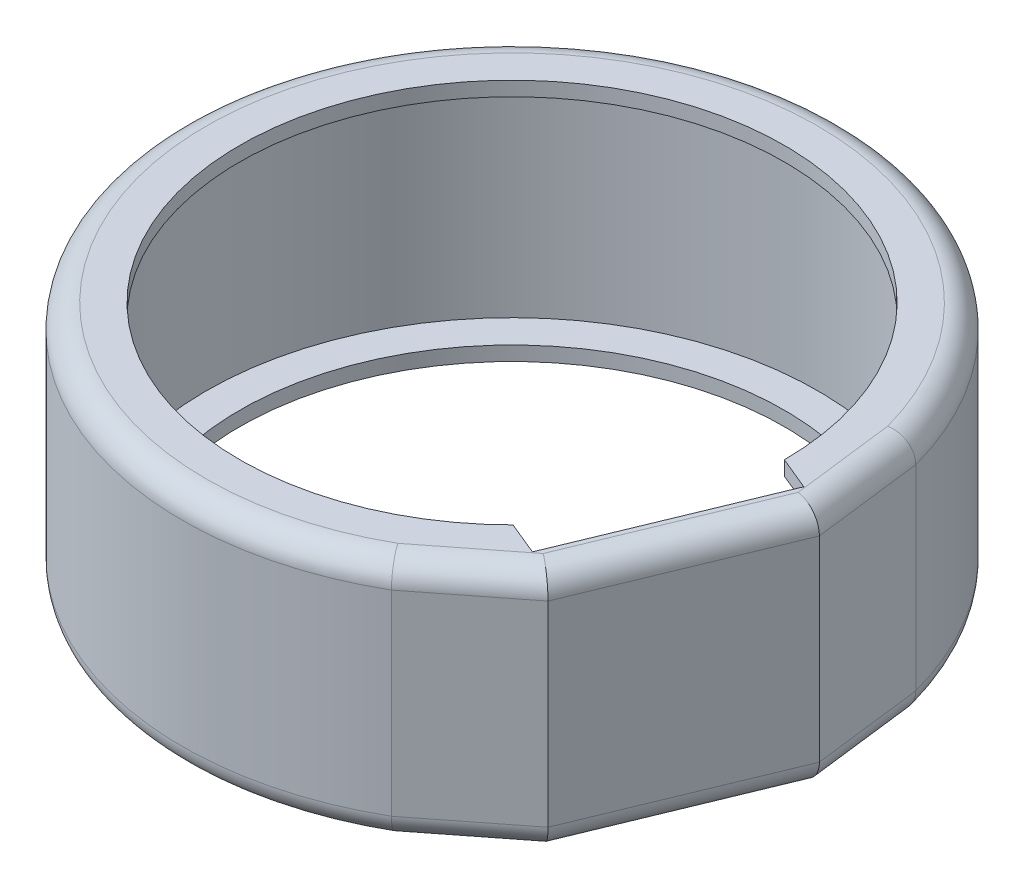
ISO-10303-21;
HEADER;
FILE_DESCRIPTION(('STEP AP214'),'2;1');
FILE_NAME('part.step','',(''),(''),'','','');
FILE_SCHEMA(('AUTOMOTIVE_DESIGN { 1 0 10303 214 1 1 1 1 }'));
ENDSEC;
DATA;
#1=APPLICATION_CONTEXT('core data for automotive mechanical design processes');
#2=APPLICATION_PROTOCOL_DEFINITION('international standard','automotive_design',2000,#1);
#3=PRODUCT_CONTEXT('',#1,'mechanical');
#4=PRODUCT('Part','Part','',(#3));
#5=PRODUCT_RELATED_PRODUCT_CATEGORY('part','',(#4));
#6=PRODUCT_DEFINITION_FORMATION('','',#4);
#7=PRODUCT_DEFINITION_CONTEXT('part definition',#1,'design');
#8=PRODUCT_DEFINITION('design','',#6,#7);
#9=PRODUCT_DEFINITION_SHAPE('','',#8);
#10=(LENGTH_UNIT() NAMED_UNIT(*) SI_UNIT(.MILLI.,.METRE.));
#11=(NAMED_UNIT(*) PLANE_ANGLE_UNIT() SI_UNIT($,.RADIAN.));
#12=(NAMED_UNIT(*) SI_UNIT($,.STERADIAN.) SOLID_ANGLE_UNIT());
#13=UNCERTAINTY_MEASURE_WITH_UNIT(LENGTH_MEASURE(1.E-05),#10,'distance_accuracy_value','');
#14=(GEOMETRIC_REPRESENTATION_CONTEXT(3) GLOBAL_UNCERTAINTY_ASSIGNED_CONTEXT((#13)) GLOBAL_UNIT_ASSIGNED_CONTEXT((#10,
#11,#12)) REPRESENTATION_CONTEXT('',''));
#15=CARTESIAN_POINT('',(0.,0.,0.));
#16=DIRECTION('',(0.,0.,1.));
#17=DIRECTION('',(1.,0.,0.));
#18=AXIS2_PLACEMENT_3D('',#15,#16,#17);
#19=CARTESIAN_POINT('',(12.5713590861021,-0.4,-1.54597575397623));
#20=DIRECTION('',(-0.122056550207776,0.,-0.992523147614894));
#21=DIRECTION('',(-0.992523147614894,0.,0.122056550207776));
#22=AXIS2_PLACEMENT_3D('',#19,#20,#21);
#23=CYLINDRICAL_SURFACE('',#22,1.);
#24=CARTESIAN_POINT('',(12.8711156040075,-0.4,0.891544249358785));
#25=DIRECTION('',(-0.134165315329187,0.,0.990958963914561));
#26=DIRECTION('',(-0.990958963914561,0.,-0.134165315329187));
#27=AXIS2_PLACEMENT_3D('',#24,#25,#26);
#28=ELLIPSE('',#27,1.03394016699174,1.);
#29=CARTESIAN_POINT('',(13.8957078806392,-0.4,1.03026315789474));
#30=VERTEX_POINT('',#29);
#31=CARTESIAN_POINT('',(12.8711156040075,0.6,0.89154424935878));
#32=VERTEX_POINT('',#31);
#33=EDGE_CURVE('E11',#30,#32,#28,.T.);
#34=ORIENTED_EDGE('',*,*,#33,.F.);
#35=DIRECTION('',(0.122056550207776,0.,0.992523147614894));
#36=VECTOR('',#35,1.);
#37=CARTESIAN_POINT('',(13.563882233717,-0.4,-1.66803230418401));
#38=LINE('',#37,#36);
#39=CARTESIAN_POINT('',(13.3297764027891,-0.4,-3.5717028224148));
#40=VERTEX_POINT('',#39);
#41=EDGE_CURVE('E312',#40,#30,#38,.T.);
#42=ORIENTED_EDGE('',*,*,#41,.F.);
#43=CARTESIAN_POINT('',(13.3297764027891,-0.4,-3.57170282241479));
#44=CARTESIAN_POINT('',(13.3297762561318,-0.371916414340494,-3.5717027762906));
#45=CARTESIAN_POINT('',(13.3286115661026,-0.343846300329724,-3.57147628903287));
#46=CARTESIAN_POINT('',(13.3239653960358,-0.28790729104696,-3.57057267398163));
#47=CARTESIAN_POINT('',(13.3204840377022,-0.260038385282429,-3.56989556986085));
#48=CARTESIAN_POINT('',(13.3065984979732,-0.17708171106861,-3.56719463058089));
#49=CARTESIAN_POINT('',(13.292752758156,-0.122550249127764,-3.56450115121073));
#50=CARTESIAN_POINT('',(13.2562741146347,-0.0166322025543488,-3.55740144462552));
#51=CARTESIAN_POINT('',(13.2336372231607,0.0347529426085676,-3.55299444013422));
#52=CARTESIAN_POINT('',(13.1802302598131,0.132923749634682,-3.5425903151592));
#53=CARTESIAN_POINT('',(13.1494619629337,0.179710412240616,-3.53659354170321));
#54=CARTESIAN_POINT('',(13.0806368889508,0.267413619696104,-3.52316864298163));
#55=CARTESIAN_POINT('',(13.0425728535977,0.308324247197636,-3.51573909225542));
#56=CARTESIAN_POINT('',(12.9602460052407,0.383086496852746,-3.49965481280123));
#57=CARTESIAN_POINT('',(12.9159810749181,0.416935697987592,-3.49099966557779));
#58=CARTESIAN_POINT('',(12.8224065407459,0.476687509612998,-3.47268340905768));
#59=CARTESIAN_POINT('',(12.7730841797457,0.502569330968472,-3.46301975469814));
#60=CARTESIAN_POINT('',(12.6709059321237,0.545528484618581,-3.44297669979578));
#61=CARTESIAN_POINT('',(12.6180531478254,0.562613435020208,-3.43259792740931));
#62=CARTESIAN_POINT('',(12.5310653185663,0.582741908676377,-3.41549501655581));
#63=CARTESIAN_POINT('',(12.4975393399765,0.588658196474452,-3.40889854595797));
#64=CARTESIAN_POINT('',(12.4301018378076,0.596928945404694,-3.39561958375672));
#65=CARTESIAN_POINT('',(12.3961909812984,0.599288832881079,-3.38893723892541));
#66=CARTESIAN_POINT('',(12.356827980813,0.599954135942361,-3.38117451273628));
#67=CARTESIAN_POINT('',(12.3513825411945,0.60000012180395,-3.38010049138206));
#68=CARTESIAN_POINT('',(12.345937797267,0.6,-3.37902647311527));
#69=B_SPLINE_CURVE_WITH_KNOTS('',3,(#43,#44,#45,#46,#47,#48,#49,#50,#51,#52,#53,#54,#55,#56,#57,
#58,#59,#60,#61,#62,#63,#64,#65,#66,#67,#68),.UNSPECIFIED.,.F.,.F.,(4,2,2,2,2,2,2,2,2,2,2,2,4),
(0.,0.084198950647967,0.168393478335985,0.336504907099607,0.504692682425953,0.672843774539834,
0.841163030253606,1.00953989993223,1.17835245939978,1.34701857994127,1.45089210384701,
1.55460697682603,1.57125769446634),.UNSPECIFIED.);
#70=CARTESIAN_POINT('',(12.345937797267,0.6,-3.37902647311528));
#71=VERTEX_POINT('',#70);
#72=EDGE_CURVE('E44',#40,#71,#69,.T.);
#73=ORIENTED_EDGE('',*,*,#72,.T.);
#74=DIRECTION('',(0.122056550207776,0.,0.992523147614894));
#75=VECTOR('',#74,1.);
#76=CARTESIAN_POINT('',(12.5713590861021,0.6,-1.54597575397623));
#77=LINE('',#76,#75);
#78=EDGE_CURVE('E294',#32,#71,#77,.F.);
#79=ORIENTED_EDGE('',*,*,#78,.F.);
#80=EDGE_LOOP('',(#34,#42,#73,#79));
#81=FACE_BOUND('',#80,.T.);
#82=ADVANCED_FACE('F36',(#81),#23,.T.);
#83=CARTESIAN_POINT('',(0.,-0.4,0.));
#84=DIRECTION('',(0.,1.,0.));
#85=DIRECTION('',(0.,0.,1.));
#86=AXIS2_PLACEMENT_3D('',#83,#84,#85);
#87=TOROIDAL_SURFACE('',#86,12.8,1.);
#88=ORIENTED_EDGE('',*,*,#72,.F.);
#89=CARTESIAN_POINT('',(0.,-0.4,0.));
#90=DIRECTION('',(0.,1.,0.));
#91=DIRECTION('',(0.,0.,1.));
#92=AXIS2_PLACEMENT_3D('',#89,#90,#91);
#93=CIRCLE('',#92,13.8);
#94=CARTESIAN_POINT('',(6.89999999999997,-0.4,11.9511505722253));
#95=VERTEX_POINT('',#94);
#96=EDGE_CURVE('E309',#95,#40,#93,.F.);
#97=ORIENTED_EDGE('',*,*,#96,.F.);
#98=CARTESIAN_POINT('',(6.89999999999995,-0.4,11.9511505722253));
#99=CARTESIAN_POINT('',(6.89999992935616,-0.371917426694174,11.9511504364481));
#100=CARTESIAN_POINT('',(6.89933584598267,-0.343848324888395,11.9501672122749));
#101=CARTESIAN_POINT('',(6.89668677546159,-0.287911340258808,11.9462448664894));
#102=CARTESIAN_POINT('',(6.8947018578279,-0.260043446923662,11.9433058478083));
#103=CARTESIAN_POINT('',(6.88678514804693,-0.177089876224109,11.9315832712067));
#104=CARTESIAN_POINT('',(6.87889134486308,-0.1225604966033,11.9198941141875));
#105=CARTESIAN_POINT('',(6.8580964215101,-0.0166465405634291,11.8890950438101));
#106=CARTESIAN_POINT('',(6.84519303133753,0.0347365979561592,11.8699817663444));
#107=CARTESIAN_POINT('',(6.81475513901414,0.132903679247517,11.8248834081528));
#108=CARTESIAN_POINT('',(6.79722164549352,0.179688620656828,11.7988998240654));
#109=CARTESIAN_POINT('',(6.75800874984913,0.267389836823159,11.7407694943242));
#110=CARTESIAN_POINT('',(6.73632513169545,0.308300068963971,11.7086164811844));
#111=CARTESIAN_POINT('',(6.68943771294215,0.38306204346791,11.6390635752552));
#112=CARTESIAN_POINT('',(6.6642327106441,0.416911366370878,11.6016618912985));
#113=CARTESIAN_POINT('',(6.61096304523261,0.476665634143304,11.5225803566592));
#114=CARTESIAN_POINT('',(6.58289102565305,0.502549421682252,11.480889498287));
#115=CARTESIAN_POINT('',(6.52475251437733,0.545512825455888,11.3945041353445));
#116=CARTESIAN_POINT('',(6.49468777006021,0.562600042890162,11.3498122618634));
#117=CARTESIAN_POINT('',(6.44520810563581,0.582737564275861,11.2762224141644));
#118=CARTESIAN_POINT('',(6.42613366220432,0.588658192576283,11.2478448745982));
#119=CARTESIAN_POINT('',(6.38777261485133,0.596933047618758,11.1907560803979));
#120=CARTESIAN_POINT('',(6.36848637985926,0.599292712799944,11.1620454022678));
#121=CARTESIAN_POINT('',(6.34612119389626,0.599954593683484,11.1287405339508));
#122=CARTESIAN_POINT('',(6.34304234504274,0.600000120565802,11.1241554657972));
#123=CARTESIAN_POINT('',(6.33996398285252,0.6,11.1195708863307));
#124=B_SPLINE_CURVE_WITH_KNOTS('',3,(#98,#99,#100,#101,#102,#103,#104,#105,#106,#107,#108,#109,
#110,#111,#112,#113,#114,#115,#116,#117,#118,#119,#120,#121,#122,#123),.UNSPECIFIED.,.F.,.F.,(4,
2,2,2,2,2,2,2,2,2,2,2,4),(0.,0.084195914292554,0.168387397807622,0.336492516198596,
0.504673897447146,0.672818671935146,0.841135176846776,1.0095092619555,1.17832678208629,
1.34699817950188,1.45094341699295,1.55472974410938,1.57129805830179),.UNSPECIFIED.);
#125=CARTESIAN_POINT('',(6.3399639828525,0.6,11.1195708863307));
#126=VERTEX_POINT('',#125);
#127=EDGE_CURVE('E317',#95,#126,#124,.T.);
#128=ORIENTED_EDGE('',*,*,#127,.T.);
#129=CARTESIAN_POINT('',(0.,0.6,0.));
#130=DIRECTION('',(0.,1.,0.));
#131=DIRECTION('',(0.,0.,1.));
#132=AXIS2_PLACEMENT_3D('',#129,#130,#131);
#133=CIRCLE('',#132,12.8);
#134=EDGE_CURVE('E297',#71,#126,#133,.T.);
#135=ORIENTED_EDGE('',*,*,#134,.F.);
#136=EDGE_LOOP('',(#88,#97,#128,#135));
#137=FACE_BOUND('',#136,.T.);
#138=ADVANCED_FACE('F328',(#137),#87,.T.);
#139=CARTESIAN_POINT('',(7.80842818196018,-0.4,9.9694131981489));
#140=DIRECTION('',(-0.787264297794474,0.,0.616615703188115));
#141=DIRECTION('',(0.616615703188115,0.,0.787264297794474));
#142=AXIS2_PLACEMENT_3D('',#139,#140,#141);
#143=CYLINDRICAL_SURFACE('',#142,1.);
#144=ORIENTED_EDGE('',*,*,#127,.F.);
#145=DIRECTION('',(-0.787264297794474,0.,0.616615703188115));
#146=VECTOR('',#145,1.);
#147=CARTESIAN_POINT('',(8.42504388514829,-0.4,10.7566774959434));
#148=LINE('',#147,#146);
#149=CARTESIAN_POINT('',(10.575971038534,-0.4,9.0719885510656));
#150=VERTEX_POINT('',#149);
#151=EDGE_CURVE('E306',#150,#95,#148,.T.);
#152=ORIENTED_EDGE('',*,*,#151,.F.);
#153=CARTESIAN_POINT('',(9.75209281075188,-0.4,8.44706024095035));
#154=DIRECTION('',(-0.604335682377465,0.,0.796729805520895));
#155=DIRECTION('',(-0.796729805520895,0.,-0.604335682377466));
#156=AXIS2_PLACEMENT_3D('',#153,#154,#155);
#157=ELLIPSE('',#156,1.03407481692422,1.);
#158=CARTESIAN_POINT('',(9.75209281075188,0.6,8.44706024095034));
#159=VERTEX_POINT('',#158);
#160=EDGE_CURVE('E315',#150,#159,#157,.T.);
#161=ORIENTED_EDGE('',*,*,#160,.T.);
#162=DIRECTION('',(-0.787264297794474,0.,0.616615703188115));
#163=VECTOR('',#162,1.);
#164=CARTESIAN_POINT('',(7.80842818196018,0.6,9.9694131981489));
#165=LINE('',#164,#163);
#166=EDGE_CURVE('E300',#126,#159,#165,.F.);
#167=ORIENTED_EDGE('',*,*,#166,.F.);
#168=EDGE_LOOP('',(#144,#152,#161,#167));
#169=FACE_BOUND('',#168,.T.);
#170=ADVANCED_FACE('F330',(#169),#143,.T.);
#171=CARTESIAN_POINT('',(11.311503207498,-0.4,4.66954690711175));
#172=DIRECTION('',(-0.381578947368421,0.,0.924336252088604));
#173=DIRECTION('',(0.924336252088604,0.,0.381578947368421));
#174=AXIS2_PLACEMENT_3D('',#171,#172,#173);
#175=CYLINDRICAL_SURFACE('',#174,1.);
#176=DIRECTION('',(-0.381578947368421,0.,0.924336252088604));
#177=VECTOR('',#176,1.);
#178=CARTESIAN_POINT('',(12.2358394595866,-0.4,5.05112585448017));
#179=LINE('',#178,#177);
#180=EDGE_CURVE('E290',#30,#150,#179,.T.);
#181=ORIENTED_EDGE('',*,*,#180,.F.);
#182=ORIENTED_EDGE('',*,*,#33,.T.);
#183=DIRECTION('',(-0.381578947368421,0.,0.924336252088604));
#184=VECTOR('',#183,1.);
#185=CARTESIAN_POINT('',(11.311503207498,0.6,4.66954690711175));
#186=LINE('',#185,#184);
#187=EDGE_CURVE('E303',#159,#32,#186,.F.);
#188=ORIENTED_EDGE('',*,*,#187,.F.);
#189=ORIENTED_EDGE('',*,*,#160,.F.);
#190=EDGE_LOOP('',(#181,#182,#188,#189));
#191=FACE_BOUND('',#190,.T.);
#192=ADVANCED_FACE('F38',(#191),#175,.T.);
#193=CARTESIAN_POINT('',(12.5713590861021,-8.6,-1.54597575397623));
#194=DIRECTION('',(0.122056550207776,0.,0.992523147614894));
#195=DIRECTION('',(0.992523147614894,0.,-0.122056550207776));
#196=AXIS2_PLACEMENT_3D('',#193,#194,#195);
#197=CYLINDRICAL_SURFACE('',#196,1.);
#198=CARTESIAN_POINT('',(13.3297764027891,-8.6,-3.57170282241479));
#199=CARTESIAN_POINT('',(13.3297762561318,-8.62808358565951,-3.57170277629059));
#200=CARTESIAN_POINT('',(13.3286115661026,-8.65615369967028,-3.57147628903286));
#201=CARTESIAN_POINT('',(13.3239653960358,-8.71209270895304,-3.57057267398163));
#202=CARTESIAN_POINT('',(13.3204840377022,-8.73996161471757,-3.56989556986084));
#203=CARTESIAN_POINT('',(13.3065984979732,-8.82291828893139,-3.56719463058089));
#204=CARTESIAN_POINT('',(13.292752758156,-8.87744975087223,-3.56450115121072));
#205=CARTESIAN_POINT('',(13.2562741146347,-8.98336779744565,-3.55740144462552));
#206=CARTESIAN_POINT('',(13.2336372231606,-9.03475294260857,-3.55299444013423));
#207=CARTESIAN_POINT('',(13.1802302598131,-9.13292374963468,-3.54259031515922));
#208=CARTESIAN_POINT('',(13.1494619629337,-9.17971041224062,-3.53659354170323));
#209=CARTESIAN_POINT('',(13.0806368889508,-9.2674136196961,-3.52316864298163));
#210=CARTESIAN_POINT('',(13.0425728535977,-9.30832424719764,-3.51573909225541));
#211=CARTESIAN_POINT('',(12.9602460052407,-9.38308649685275,-3.49965481280123));
#212=CARTESIAN_POINT('',(12.9159810749181,-9.41693569798759,-3.4909996655778));
#213=CARTESIAN_POINT('',(12.8224065407459,-9.476687509613,-3.47268340905769));
#214=CARTESIAN_POINT('',(12.7730841797457,-9.50256933096847,-3.46301975469814));
#215=CARTESIAN_POINT('',(12.6709059321237,-9.54552848461858,-3.44297669979579));
#216=CARTESIAN_POINT('',(12.6180531478254,-9.56261343502021,-3.43259792740933));
#217=CARTESIAN_POINT('',(12.5310653185663,-9.58274190867638,-3.41549501655582));
#218=CARTESIAN_POINT('',(12.4975393399765,-9.58865819647445,-3.40889854595798));
#219=CARTESIAN_POINT('',(12.4301018378076,-9.5969289454047,-3.39561958375673));
#220=CARTESIAN_POINT('',(12.3961909812984,-9.59928883288108,-3.38893723892544));
#221=CARTESIAN_POINT('',(12.356827980813,-9.59995413594236,-3.38117451273629));
#222=CARTESIAN_POINT('',(12.3513825411945,-9.60000012180395,-3.38010049138207));
#223=CARTESIAN_POINT('',(12.345937797267,-9.6,-3.37902647311527));
#224=B_SPLINE_CURVE_WITH_KNOTS('',3,(#198,#199,#200,#201,#202,#203,#204,#205,#206,#207,#208,
#209,#210,#211,#212,#213,#214,#215,#216,#217,#218,#219,#220,#221,#222,#223),.UNSPECIFIED.,.F.,
.F.,(4,2,2,2,2,2,2,2,2,2,2,2,4),(0.,0.0841989506479641,0.168393478335984,0.336504907099607,
0.504692682425953,0.672843774539834,0.841163030253605,1.00953989993222,1.17835245939977,
1.34701857994127,1.450892103847,1.55460697682603,1.57125769446634),.UNSPECIFIED.);
#225=CARTESIAN_POINT('',(13.3297764027891,-8.6,-3.5717028224148));
#226=VERTEX_POINT('',#225);
#227=CARTESIAN_POINT('',(12.345937797267,-9.6,-3.37902647311528));
#228=VERTEX_POINT('',#227);
#229=EDGE_CURVE('E284',#226,#228,#224,.T.);
#230=ORIENTED_EDGE('',*,*,#229,.F.);
#231=DIRECTION('',(-0.122056550207776,0.,-0.992523147614894));
#232=VECTOR('',#231,1.);
#233=CARTESIAN_POINT('',(13.563882233717,-8.6,-1.66803230418401));
#234=LINE('',#233,#232);
#235=CARTESIAN_POINT('',(13.8957078806392,-8.6,1.03026315789474));
#236=VERTEX_POINT('',#235);
#237=EDGE_CURVE('E257',#236,#226,#234,.T.);
#238=ORIENTED_EDGE('',*,*,#237,.F.);
#239=CARTESIAN_POINT('',(12.8711156040075,-8.6,0.891544249358773));
#240=DIRECTION('',(-0.134165315329187,0.,0.990958963914561));
#241=DIRECTION('',(0.990958963914561,0.,0.134165315329187));
#242=AXIS2_PLACEMENT_3D('',#239,#240,#241);
#243=ELLIPSE('',#242,1.03394016699174,1.);
#244=CARTESIAN_POINT('',(12.8711156040075,-9.6,0.89154424935878));
#245=VERTEX_POINT('',#244);
#246=EDGE_CURVE('E291',#236,#245,#243,.F.);
#247=ORIENTED_EDGE('',*,*,#246,.T.);
#248=DIRECTION('',(-0.122056550207776,0.,-0.992523147614894));
#249=VECTOR('',#248,1.);
#250=CARTESIAN_POINT('',(12.5713590861021,-9.6,-1.54597575397623));
#251=LINE('',#250,#249);
#252=EDGE_CURVE('E239',#228,#245,#251,.F.);
#253=ORIENTED_EDGE('',*,*,#252,.F.);
#254=EDGE_LOOP('',(#230,#238,#247,#253));
#255=FACE_BOUND('',#254,.T.);
#256=ADVANCED_FACE('F279',(#255),#197,.T.);
#257=CARTESIAN_POINT('',(11.311503207498,-8.6,4.66954690711175));
#258=DIRECTION('',(0.381578947368421,0.,-0.924336252088604));
#259=DIRECTION('',(-0.924336252088604,0.,-0.381578947368421));
#260=AXIS2_PLACEMENT_3D('',#257,#258,#259);
#261=CYLINDRICAL_SURFACE('',#260,1.);
#262=ORIENTED_EDGE('',*,*,#246,.F.);
#263=DIRECTION('',(0.381578947368421,0.,-0.924336252088604));
#264=VECTOR('',#263,1.);
#265=CARTESIAN_POINT('',(12.2358394595866,-8.6,5.05112585448017));
#266=LINE('',#265,#264);
#267=CARTESIAN_POINT('',(10.575971038534,-8.6,9.0719885510656));
#268=VERTEX_POINT('',#267);
#269=EDGE_CURVE('E254',#268,#236,#266,.T.);
#270=ORIENTED_EDGE('',*,*,#269,.F.);
#271=CARTESIAN_POINT('',(9.75209281075188,-8.6,8.44706024095034));
#272=DIRECTION('',(0.604335682377465,0.,-0.796729805520895));
#273=DIRECTION('',(-0.796729805520895,0.,-0.604335682377466));
#274=AXIS2_PLACEMENT_3D('',#271,#272,#273);
#275=ELLIPSE('',#274,1.03407481692422,1.);
#276=CARTESIAN_POINT('',(9.75209281075188,-9.6,8.44706024095034));
#277=VERTEX_POINT('',#276);
#278=EDGE_CURVE('E268',#268,#277,#275,.T.);
#279=ORIENTED_EDGE('',*,*,#278,.T.);
#280=DIRECTION('',(0.381578947368421,0.,-0.924336252088604));
#281=VECTOR('',#280,1.);
#282=CARTESIAN_POINT('',(11.311503207498,-9.6,4.66954690711175));
#283=LINE('',#282,#281);
#284=EDGE_CURVE('E242',#245,#277,#283,.F.);
#285=ORIENTED_EDGE('',*,*,#284,.F.);
#286=EDGE_LOOP('',(#262,#270,#279,#285));
#287=FACE_BOUND('',#286,.T.);
#288=ADVANCED_FACE('F355',(#287),#261,.T.);
#289=CARTESIAN_POINT('',(7.80842818196018,-8.6,9.9694131981489));
#290=DIRECTION('',(0.787264297794474,0.,-0.616615703188115));
#291=DIRECTION('',(-0.616615703188115,0.,-0.787264297794474));
#292=AXIS2_PLACEMENT_3D('',#289,#290,#291);
#293=CYLINDRICAL_SURFACE('',#292,1.);
#294=ORIENTED_EDGE('',*,*,#278,.F.);
#295=DIRECTION('',(0.787264297794474,0.,-0.616615703188115));
#296=VECTOR('',#295,1.);
#297=CARTESIAN_POINT('',(8.42504388514829,-8.6,10.7566774959434));
#298=LINE('',#297,#296);
#299=CARTESIAN_POINT('',(6.89999999999997,-8.6,11.9511505722253));
#300=VERTEX_POINT('',#299);
#301=EDGE_CURVE('E251',#300,#268,#298,.T.);
#302=ORIENTED_EDGE('',*,*,#301,.F.);
#303=CARTESIAN_POINT('',(6.89999999999995,-8.6,11.9511505722253));
#304=CARTESIAN_POINT('',(6.89999992935615,-8.62808257330583,11.9511504364481));
#305=CARTESIAN_POINT('',(6.89933584598266,-8.65615167511161,11.9501672122749));
#306=CARTESIAN_POINT('',(6.89668677546159,-8.71208865974119,11.9462448664894));
#307=CARTESIAN_POINT('',(6.8947018578279,-8.73995655307634,11.9433058478083));
#308=CARTESIAN_POINT('',(6.88678514804694,-8.82291012377589,11.9315832712067));
#309=CARTESIAN_POINT('',(6.87889134486309,-8.8774395033967,11.9198941141875));
#310=CARTESIAN_POINT('',(6.8580964215101,-8.98335345943657,11.8890950438101));
#311=CARTESIAN_POINT('',(6.84519303133753,-9.03473659795616,11.8699817663444));
#312=CARTESIAN_POINT('',(6.81475513901414,-9.13290367924752,11.8248834081528));
#313=CARTESIAN_POINT('',(6.79722164549353,-9.17968862065683,11.7988998240654));
#314=CARTESIAN_POINT('',(6.75800874984913,-9.26738983682316,11.7407694943242));
#315=CARTESIAN_POINT('',(6.73632513169545,-9.30830006896397,11.7086164811844));
#316=CARTESIAN_POINT('',(6.68943771294214,-9.38306204346791,11.6390635752552));
#317=CARTESIAN_POINT('',(6.6642327106441,-9.41691136637088,11.6016618912985));
#318=CARTESIAN_POINT('',(6.61096304523261,-9.4766656341433,11.5225803566592));
#319=CARTESIAN_POINT('',(6.58289102565305,-9.50254942168225,11.480889498287));
#320=CARTESIAN_POINT('',(6.52475251437732,-9.54551282545589,11.3945041353445));
#321=CARTESIAN_POINT('',(6.49468777006022,-9.56260004289016,11.3498122618634));
#322=CARTESIAN_POINT('',(6.44520810563578,-9.58273756427586,11.2762224141644));
#323=CARTESIAN_POINT('',(6.42613366220426,-9.58865819257628,11.2478448745982));
#324=CARTESIAN_POINT('',(6.38777261485134,-9.59693304761876,11.1907560803979));
#325=CARTESIAN_POINT('',(6.36848637985936,-9.59929271279995,11.1620454022678));
#326=CARTESIAN_POINT('',(6.3461211938963,-9.59995459368348,11.1287405339508));
#327=CARTESIAN_POINT('',(6.34304234504276,-9.6000001205658,11.1241554657972));
#328=CARTESIAN_POINT('',(6.33996398285252,-9.6,11.1195708863307));
#329=B_SPLINE_CURVE_WITH_KNOTS('',3,(#303,#304,#305,#306,#307,#308,#309,#310,#311,#312,#313,
#314,#315,#316,#317,#318,#319,#320,#321,#322,#323,#324,#325,#326,#327,#328),.UNSPECIFIED.,.F.,
.F.,(4,2,2,2,2,2,2,2,2,2,2,2,4),(0.,0.0841959142925554,0.168387397807621,0.336492516198595,
0.504673897447145,0.672818671935145,0.841135176846775,1.0095092619555,1.17832678208628,
1.34699817950188,1.45094341699295,1.55472974410938,1.5712980583018),.UNSPECIFIED.);
#330=CARTESIAN_POINT('',(6.33996398285251,-9.6,11.1195708863307));
#331=VERTEX_POINT('',#330);
#332=EDGE_CURVE('E260',#300,#331,#329,.T.);
#333=ORIENTED_EDGE('',*,*,#332,.T.);
#334=DIRECTION('',(0.787264297794474,0.,-0.616615703188115));
#335=VECTOR('',#334,1.);
#336=CARTESIAN_POINT('',(7.80842818196018,-9.6,9.9694131981489));
#337=LINE('',#336,#335);
#338=EDGE_CURVE('E245',#277,#331,#337,.F.);
#339=ORIENTED_EDGE('',*,*,#338,.F.);
#340=EDGE_LOOP('',(#294,#302,#333,#339));
#341=FACE_BOUND('',#340,.T.);
#342=ADVANCED_FACE('F270',(#341),#293,.T.);
#343=CARTESIAN_POINT('',(0.,-8.6,0.));
#344=DIRECTION('',(0.,-1.,0.));
#345=DIRECTION('',(0.,0.,-1.));
#346=AXIS2_PLACEMENT_3D('',#343,#344,#345);
#347=TOROIDAL_SURFACE('',#346,12.8,1.);
#348=CARTESIAN_POINT('',(0.,-8.6,0.));
#349=DIRECTION('',(0.,-1.,0.));
#350=DIRECTION('',(0.,0.,-1.));
#351=AXIS2_PLACEMENT_3D('',#348,#349,#350);
#352=CIRCLE('',#351,13.8);
#353=EDGE_CURVE('E233',#226,#300,#352,.F.);
#354=ORIENTED_EDGE('',*,*,#353,.F.);
#355=ORIENTED_EDGE('',*,*,#229,.T.);
#356=CARTESIAN_POINT('',(0.,-9.6,0.));
#357=DIRECTION('',(0.,-1.,0.));
#358=DIRECTION('',(0.,0.,-1.));
#359=AXIS2_PLACEMENT_3D('',#356,#357,#358);
#360=CIRCLE('',#359,12.8);
#361=EDGE_CURVE('E248',#331,#228,#360,.T.);
#362=ORIENTED_EDGE('',*,*,#361,.F.);
#363=ORIENTED_EDGE('',*,*,#332,.F.);
#364=EDGE_LOOP('',(#354,#355,#362,#363));
#365=FACE_BOUND('',#364,.T.);
#366=ADVANCED_FACE('F273',(#365),#347,.T.);
#367=CARTESIAN_POINT('',(13.563882233717,0.6,-1.66803230418401));
#368=DIRECTION('',(-0.992523147614894,0.,0.122056550207776));
#369=DIRECTION('',(0.122056550207776,0.,0.992523147614894));
#370=AXIS2_PLACEMENT_3D('',#367,#368,#369);
#371=PLANE('',#370);
#372=DIRECTION('',(0.,-1.,0.));
#373=VECTOR('',#372,1.);
#374=CARTESIAN_POINT('',(13.3297764027891,0.6,-3.5717028224148));
#375=LINE('',#374,#373);
#376=EDGE_CURVE('E231',#40,#226,#375,.T.);
#377=ORIENTED_EDGE('',*,*,#376,.F.);
#378=ORIENTED_EDGE('',*,*,#41,.T.);
#379=DIRECTION('',(0.,-1.,0.));
#380=VECTOR('',#379,1.);
#381=CARTESIAN_POINT('',(13.8957078806392,0.6,1.03026315789474));
#382=LINE('',#381,#380);
#383=EDGE_CURVE('E224',#30,#236,#382,.T.);
#384=ORIENTED_EDGE('',*,*,#383,.T.);
#385=ORIENTED_EDGE('',*,*,#237,.T.);
#386=EDGE_LOOP('',(#377,#378,#384,#385));
#387=FACE_BOUND('',#386,.T.);
#388=ADVANCED_FACE('F277',(#387),#371,.F.);
#389=CARTESIAN_POINT('',(0.,0.6,0.));
#390=DIRECTION('',(0.,-1.,0.));
#391=DIRECTION('',(0.,0.,-1.));
#392=AXIS2_PLACEMENT_3D('',#389,#390,#391);
#393=CYLINDRICAL_SURFACE('',#392,13.8);
#394=DIRECTION('',(0.,-1.,0.));
#395=VECTOR('',#394,1.);
#396=CARTESIAN_POINT('',(6.89999999999997,0.6,11.9511505722253));
#397=LINE('',#396,#395);
#398=EDGE_CURVE('E229',#95,#300,#397,.T.);
#399=ORIENTED_EDGE('',*,*,#398,.F.);
#400=ORIENTED_EDGE('',*,*,#96,.T.);
#401=ORIENTED_EDGE('',*,*,#376,.T.);
#402=ORIENTED_EDGE('',*,*,#353,.T.);
#403=EDGE_LOOP('',(#399,#400,#401,#402));
#404=FACE_BOUND('',#403,.T.);
#405=ADVANCED_FACE('F368',(#404),#393,.T.);
#406=CARTESIAN_POINT('',(8.42504388514829,0.6,10.7566774959434));
#407=DIRECTION('',(0.616615703188115,0.,0.787264297794474));
#408=DIRECTION('',(0.787264297794474,0.,-0.616615703188115));
#409=AXIS2_PLACEMENT_3D('',#406,#407,#408);
#410=PLANE('',#409);
#411=DIRECTION('',(0.,-1.,0.));
#412=VECTOR('',#411,1.);
#413=CARTESIAN_POINT('',(10.575971038534,0.6,9.0719885510656));
#414=LINE('',#413,#412);
#415=EDGE_CURVE('E226',#150,#268,#414,.T.);
#416=ORIENTED_EDGE('',*,*,#415,.F.);
#417=ORIENTED_EDGE('',*,*,#151,.T.);
#418=ORIENTED_EDGE('',*,*,#398,.T.);
#419=ORIENTED_EDGE('',*,*,#301,.T.);
#420=EDGE_LOOP('',(#416,#417,#418,#419));
#421=FACE_BOUND('',#420,.T.);
#422=ADVANCED_FACE('F361',(#421),#410,.T.);
#423=CARTESIAN_POINT('',(0.,0.6,0.));
#424=DIRECTION('',(0.,-1.,0.));
#425=DIRECTION('',(0.,0.,-1.));
#426=AXIS2_PLACEMENT_3D('',#423,#424,#425);
#427=CYLINDRICAL_SURFACE('',#426,11.4);
#428=CARTESIAN_POINT('',(0.,0.,0.));
#429=DIRECTION('',(0.,1.,0.));
#430=DIRECTION('',(0.,0.,1.));
#431=AXIS2_PLACEMENT_3D('',#428,#429,#430);
#432=CIRCLE('',#431,11.4);
#433=CARTESIAN_POINT('',(11.4,0.,0.));
#434=VERTEX_POINT('',#433);
#435=CARTESIAN_POINT('',(8.08026315789474,0.,8.04172539317086));
#436=VERTEX_POINT('',#435);
#437=EDGE_CURVE('E219',#434,#436,#432,.T.);
#438=ORIENTED_EDGE('',*,*,#437,.F.);
#439=DIRECTION('',(0.,-1.,0.));
#440=VECTOR('',#439,1.);
#441=CARTESIAN_POINT('',(11.4,0.6,0.));
#442=LINE('',#441,#440);
#443=CARTESIAN_POINT('',(11.4,0.6,0.));
#444=VERTEX_POINT('',#443);
#445=EDGE_CURVE('E227',#444,#434,#442,.T.);
#446=ORIENTED_EDGE('',*,*,#445,.F.);
#447=CARTESIAN_POINT('',(0.,0.6,0.));
#448=DIRECTION('',(0.,1.,0.));
#449=DIRECTION('',(0.,0.,1.));
#450=AXIS2_PLACEMENT_3D('',#447,#448,#449);
#451=CIRCLE('',#450,11.4);
#452=CARTESIAN_POINT('',(8.08026315789474,0.600000000000003,8.04172539317086));
#453=VERTEX_POINT('',#452);
#454=EDGE_CURVE('E176',#444,#453,#451,.T.);
#455=ORIENTED_EDGE('',*,*,#454,.T.);
#456=DIRECTION('',(0.,-1.,0.));
#457=VECTOR('',#456,1.);
#458=CARTESIAN_POINT('',(8.08026315789474,0.6,8.04172539317086));
#459=LINE('',#458,#457);
#460=EDGE_CURVE('E221',#453,#436,#459,.T.);
#461=ORIENTED_EDGE('',*,*,#460,.T.);
#462=EDGE_LOOP('',(#438,#446,#455,#461));
#463=FACE_BOUND('',#462,.T.);
#464=ADVANCED_FACE('F536',(#463),#427,.F.);
#465=CARTESIAN_POINT('',(12.2358394595866,0.6,5.05112585448017));
#466=DIRECTION('',(0.924336252088604,0.,0.381578947368421));
#467=DIRECTION('',(0.381578947368421,0.,-0.924336252088604));
#468=AXIS2_PLACEMENT_3D('',#465,#466,#467);
#469=PLANE('',#468);
#470=ORIENTED_EDGE('',*,*,#383,.F.);
#471=ORIENTED_EDGE('',*,*,#180,.T.);
#472=ORIENTED_EDGE('',*,*,#415,.T.);
#473=ORIENTED_EDGE('',*,*,#269,.T.);
#474=EDGE_LOOP('',(#470,#471,#472,#473));
#475=FACE_BOUND('',#474,.T.);
#476=ADVANCED_FACE('F351',(#475),#469,.T.);
#477=CARTESIAN_POINT('',(0.,0.6,0.));
#478=DIRECTION('',(0.,1.,0.));
#479=DIRECTION('',(0.,0.,1.));
#480=AXIS2_PLACEMENT_3D('',#477,#478,#479);
#481=PLANE('',#480);
#482=DIRECTION('',(-0.924336252088604,0.,-0.381578947368421));
#483=VECTOR('',#482,1.);
#484=CARTESIAN_POINT('',(9.46676753602765,0.600000000000003,8.61409381422349));
#485=LINE('',#484,#483);
#486=CARTESIAN_POINT('',(9.46676753602765,0.600000000000003,8.61409381422349));
#487=VERTEX_POINT('',#486);
#488=EDGE_CURVE('E193',#487,#453,#485,.T.);
#489=ORIENTED_EDGE('',*,*,#488,.T.);
#490=ORIENTED_EDGE('',*,*,#454,.F.);
#491=DIRECTION('',(-0.924336252088604,0.,-0.381578947368421));
#492=VECTOR('',#491,1.);
#493=CARTESIAN_POINT('',(12.7865043781329,0.6,0.572368421052631));
#494=LINE('',#493,#492);
#495=CARTESIAN_POINT('',(12.7865043781329,0.6,0.572368421052631));
#496=VERTEX_POINT('',#495);
#497=EDGE_CURVE('E157',#496,#444,#494,.T.);
#498=ORIENTED_EDGE('',*,*,#497,.F.);
#499=DIRECTION('',(0.381578947368421,0.,-0.924336252088604));
#500=VECTOR('',#499,1.);
#501=CARTESIAN_POINT('',(12.7865043781329,0.6,0.572368421052631));
#502=LINE('',#501,#500);
#503=EDGE_CURVE('E162',#487,#496,#502,.T.);
#504=ORIENTED_EDGE('',*,*,#503,.F.);
#505=EDGE_LOOP('',(#489,#490,#498,#504));
#506=FACE_BOUND('',#505,.T.);
#507=ORIENTED_EDGE('',*,*,#166,.T.);
#508=ORIENTED_EDGE('',*,*,#187,.T.);
#509=ORIENTED_EDGE('',*,*,#78,.T.);
#510=ORIENTED_EDGE('',*,*,#134,.T.);
#511=EDGE_LOOP('',(#507,#508,#509,#510));
#512=FACE_BOUND('',#511,.T.);
#513=ADVANCED_FACE('F173',(#506,#512),#481,.T.);
#514=CARTESIAN_POINT('',(0.,0.,0.));
#515=DIRECTION('',(0.,1.,0.));
#516=DIRECTION('',(0.,0.,1.));
#517=AXIS2_PLACEMENT_3D('',#514,#515,#516);
#518=PLANE('',#517);
#519=ORIENTED_EDGE('',*,*,#437,.T.);
#520=DIRECTION('',(-0.924336252088604,0.,-0.381578947368421));
#521=VECTOR('',#520,1.);
#522=CARTESIAN_POINT('',(9.46676753602765,0.,8.61409381422349));
#523=LINE('',#522,#521);
#524=CARTESIAN_POINT('',(9.45843690544902,0.,8.61065481327559));
#525=VERTEX_POINT('',#524);
#526=EDGE_CURVE('E178',#525,#436,#523,.T.);
#527=ORIENTED_EDGE('',*,*,#526,.F.);
#528=DIRECTION('',(-0.38268343236509,0.,0.923879532511287));
#529=VECTOR('',#528,1.);
#530=CARTESIAN_POINT('',(9.44811574758376,0.,8.63557229257331));
#531=LINE('',#530,#529);
#532=CARTESIAN_POINT('',(9.44811574758376,0.,8.63557229257331));
#533=VERTEX_POINT('',#532);
#534=EDGE_CURVE('E210',#525,#533,#531,.T.);
#535=ORIENTED_EDGE('',*,*,#534,.T.);
#536=CARTESIAN_POINT('',(0.,0.,0.));
#537=DIRECTION('',(0.,-1.,0.));
#538=DIRECTION('',(0.,0.,-1.));
#539=AXIS2_PLACEMENT_3D('',#536,#537,#538);
#540=CIRCLE('',#539,12.8);
#541=CARTESIAN_POINT('',(12.7870984420571,0.,0.574554987046652));
#542=VERTEX_POINT('',#541);
#543=EDGE_CURVE('E199',#533,#542,#540,.T.);
#544=ORIENTED_EDGE('',*,*,#543,.T.);
#545=CARTESIAN_POINT('',(12.3441328172115,0.,1.64396860621414));
#546=VERTEX_POINT('',#545);
#547=EDGE_CURVE('E204',#542,#546,#531,.T.);
#548=ORIENTED_EDGE('',*,*,#547,.T.);
#549=DIRECTION('',(-0.381578947368421,0.,0.924336252088604));
#550=VECTOR('',#549,1.);
#551=CARTESIAN_POINT('',(12.7865043781329,0.,0.572368421052631));
#552=LINE('',#551,#550);
#553=CARTESIAN_POINT('',(12.7865043781329,0.,0.572368421052631));
#554=VERTEX_POINT('',#553);
#555=EDGE_CURVE('E51',#554,#546,#552,.T.);
#556=ORIENTED_EDGE('',*,*,#555,.F.);
#557=DIRECTION('',(-0.924336252088604,0.,-0.381578947368421));
#558=VECTOR('',#557,1.);
#559=CARTESIAN_POINT('',(12.7865043781329,0.,0.572368421052631));
#560=LINE('',#559,#558);
#561=EDGE_CURVE('E160',#554,#434,#560,.T.);
#562=ORIENTED_EDGE('',*,*,#561,.T.);
#563=EDGE_LOOP('',(#519,#527,#535,#544,#548,#556,#562));
#564=FACE_BOUND('',#563,.T.);
#565=ADVANCED_FACE('F473',(#564),#518,.F.);
#566=CARTESIAN_POINT('',(0.,-9.,0.));
#567=DIRECTION('',(0.,1.,0.));
#568=DIRECTION('',(0.,0.,1.));
#569=AXIS2_PLACEMENT_3D('',#566,#567,#568);
#570=CYLINDRICAL_SURFACE('',#569,12.8);
#571=ORIENTED_EDGE('',*,*,#543,.F.);
#572=DIRECTION('',(0.,1.,0.));
#573=VECTOR('',#572,1.);
#574=CARTESIAN_POINT('',(9.44811574758376,-9.,8.63557229257331));
#575=LINE('',#574,#573);
#576=CARTESIAN_POINT('',(9.44811574758376,-9.,8.63557229257331));
#577=VERTEX_POINT('',#576);
#578=EDGE_CURVE('E207',#577,#533,#575,.T.);
#579=ORIENTED_EDGE('',*,*,#578,.F.);
#580=CARTESIAN_POINT('',(0.,-9.,0.));
#581=DIRECTION('',(0.,-1.,0.));
#582=DIRECTION('',(0.,0.,-1.));
#583=AXIS2_PLACEMENT_3D('',#580,#581,#582);
#584=CIRCLE('',#583,12.8);
#585=CARTESIAN_POINT('',(12.7870984420571,-9.,0.574554987046653));
#586=VERTEX_POINT('',#585);
#587=EDGE_CURVE('E200',#577,#586,#584,.T.);
#588=ORIENTED_EDGE('',*,*,#587,.T.);
#589=DIRECTION('',(0.,1.,0.));
#590=VECTOR('',#589,1.);
#591=CARTESIAN_POINT('',(12.7870984420571,-9.,0.574554987046652));
#592=LINE('',#591,#590);
#593=EDGE_CURVE('E216',#586,#542,#592,.T.);
#594=ORIENTED_EDGE('',*,*,#593,.T.);
#595=EDGE_LOOP('',(#571,#579,#588,#594));
#596=FACE_BOUND('',#595,.T.);
#597=ADVANCED_FACE('F469',(#596),#570,.F.);
#598=CARTESIAN_POINT('',(9.44811574758376,-9.,8.63557229257331));
#599=DIRECTION('',(-0.923879532511287,0.,-0.38268343236509));
#600=DIRECTION('',(-0.38268343236509,0.,0.923879532511287));
#601=AXIS2_PLACEMENT_3D('',#598,#599,#600);
#602=PLANE('',#601);
#603=ORIENTED_EDGE('',*,*,#547,.F.);
#604=ORIENTED_EDGE('',*,*,#593,.F.);
#605=DIRECTION('',(-0.38268343236509,0.,0.923879532511287));
#606=VECTOR('',#605,1.);
#607=CARTESIAN_POINT('',(9.44811574758376,-9.,8.63557229257331));
#608=LINE('',#607,#606);
#609=EDGE_CURVE('E203',#586,#577,#608,.T.);
#610=ORIENTED_EDGE('',*,*,#609,.T.);
#611=ORIENTED_EDGE('',*,*,#578,.T.);
#612=ORIENTED_EDGE('',*,*,#534,.F.);
#613=EDGE_CURVE('E213',#546,#525,#531,.T.);
#614=ORIENTED_EDGE('',*,*,#613,.F.);
#615=EDGE_LOOP('',(#603,#604,#610,#611,#612,#614));
#616=FACE_BOUND('',#615,.T.);
#617=ADVANCED_FACE('F461',(#616),#602,.T.);
#618=CARTESIAN_POINT('',(0.,-9.,0.));
#619=DIRECTION('',(0.,-1.,0.));
#620=DIRECTION('',(0.,0.,-1.));
#621=AXIS2_PLACEMENT_3D('',#618,#619,#620);
#622=PLANE('',#621);
#623=CARTESIAN_POINT('',(0.,-9.,0.));
#624=DIRECTION('',(0.,-1.,0.));
#625=DIRECTION('',(0.,0.,-1.));
#626=AXIS2_PLACEMENT_3D('',#623,#624,#625);
#627=CIRCLE('',#626,11.4);
#628=CARTESIAN_POINT('',(8.08026315789474,-9.,8.04172539317086));
#629=VERTEX_POINT('',#628);
#630=CARTESIAN_POINT('',(11.4,-9.,0.));
#631=VERTEX_POINT('',#630);
#632=EDGE_CURVE('E190',#629,#631,#627,.T.);
#633=ORIENTED_EDGE('',*,*,#632,.T.);
#634=DIRECTION('',(0.381578947368421,0.,-0.924336252088604));
#635=VECTOR('',#634,1.);
#636=CARTESIAN_POINT('',(9.74013157894737,-9.,4.02086269658543));
#637=LINE('',#636,#635);
#638=EDGE_CURVE('E187',#629,#631,#637,.T.);
#639=ORIENTED_EDGE('',*,*,#638,.F.);
#640=EDGE_LOOP('',(#633,#639));
#641=FACE_BOUND('',#640,.T.);
#642=ORIENTED_EDGE('',*,*,#609,.F.);
#643=ORIENTED_EDGE('',*,*,#587,.F.);
#644=EDGE_LOOP('',(#642,#643));
#645=FACE_BOUND('',#644,.T.);
#646=ADVANCED_FACE('F451',(#641,#645),#622,.F.);
#647=CARTESIAN_POINT('',(0.,-9.6,0.));
#648=DIRECTION('',(0.,1.,0.));
#649=DIRECTION('',(0.,0.,1.));
#650=AXIS2_PLACEMENT_3D('',#647,#648,#649);
#651=CYLINDRICAL_SURFACE('',#650,11.4);
#652=ORIENTED_EDGE('',*,*,#632,.F.);
#653=DIRECTION('',(0.,1.,0.));
#654=VECTOR('',#653,1.);
#655=CARTESIAN_POINT('',(8.08026315789474,-9.6,8.04172539317086));
#656=LINE('',#655,#654);
#657=CARTESIAN_POINT('',(8.08026315789474,-9.6,8.04172539317086));
#658=VERTEX_POINT('',#657);
#659=EDGE_CURVE('E197',#658,#629,#656,.T.);
#660=ORIENTED_EDGE('',*,*,#659,.F.);
#661=CARTESIAN_POINT('',(0.,-9.6,0.));
#662=DIRECTION('',(0.,-1.,0.));
#663=DIRECTION('',(0.,0.,-1.));
#664=AXIS2_PLACEMENT_3D('',#661,#662,#663);
#665=CIRCLE('',#664,11.4);
#666=CARTESIAN_POINT('',(11.4,-9.6,0.));
#667=VERTEX_POINT('',#666);
#668=EDGE_CURVE('E183',#658,#667,#665,.T.);
#669=ORIENTED_EDGE('',*,*,#668,.T.);
#670=DIRECTION('',(0.,1.,0.));
#671=VECTOR('',#670,1.);
#672=CARTESIAN_POINT('',(11.4,-9.6,0.));
#673=LINE('',#672,#671);
#674=EDGE_CURVE('E189',#667,#631,#673,.T.);
#675=ORIENTED_EDGE('',*,*,#674,.T.);
#676=EDGE_LOOP('',(#652,#660,#669,#675));
#677=FACE_BOUND('',#676,.T.);
#678=ADVANCED_FACE('F440',(#677),#651,.F.);
#679=CARTESIAN_POINT('',(9.74013157894737,-9.6,4.02086269658543));
#680=DIRECTION('',(0.924336252088604,0.,0.381578947368421));
#681=DIRECTION('',(0.381578947368421,0.,-0.924336252088604));
#682=AXIS2_PLACEMENT_3D('',#679,#680,#681);
#683=PLANE('',#682);
#684=ORIENTED_EDGE('',*,*,#638,.T.);
#685=ORIENTED_EDGE('',*,*,#674,.F.);
#686=DIRECTION('',(0.381578947368421,0.,-0.924336252088604));
#687=VECTOR('',#686,1.);
#688=CARTESIAN_POINT('',(9.74013157894737,-9.6,4.02086269658543));
#689=LINE('',#688,#687);
#690=EDGE_CURVE('E186',#658,#667,#689,.T.);
#691=ORIENTED_EDGE('',*,*,#690,.F.);
#692=ORIENTED_EDGE('',*,*,#659,.T.);
#693=EDGE_LOOP('',(#684,#685,#691,#692));
#694=FACE_BOUND('',#693,.T.);
#695=ADVANCED_FACE('F406',(#694),#683,.F.);
#696=CARTESIAN_POINT('',(0.,-9.6,0.));
#697=DIRECTION('',(0.,-1.,0.));
#698=DIRECTION('',(0.,0.,-1.));
#699=AXIS2_PLACEMENT_3D('',#696,#697,#698);
#700=PLANE('',#699);
#701=ORIENTED_EDGE('',*,*,#338,.T.);
#702=ORIENTED_EDGE('',*,*,#361,.T.);
#703=ORIENTED_EDGE('',*,*,#252,.T.);
#704=ORIENTED_EDGE('',*,*,#284,.T.);
#705=EDGE_LOOP('',(#701,#702,#703,#704));
#706=FACE_BOUND('',#705,.T.);
#707=ORIENTED_EDGE('',*,*,#668,.F.);
#708=ORIENTED_EDGE('',*,*,#690,.T.);
#709=EDGE_LOOP('',(#707,#708));
#710=FACE_BOUND('',#709,.T.);
#711=ADVANCED_FACE('F372',(#706,#710),#700,.T.);
#712=CARTESIAN_POINT('',(9.46676753602765,0.600000000000003,8.61409381422349));
#713=DIRECTION('',(-0.381578947368421,0.,0.924336252088604));
#714=DIRECTION('',(0.924336252088604,0.,0.381578947368421));
#715=AXIS2_PLACEMENT_3D('',#712,#713,#714);
#716=PLANE('',#715);
#717=ORIENTED_EDGE('',*,*,#460,.F.);
#718=ORIENTED_EDGE('',*,*,#488,.F.);
#719=DIRECTION('',(0.,1.,0.));
#720=VECTOR('',#719,1.);
#721=CARTESIAN_POINT('',(9.46676753602765,0.600000000000003,8.61409381422349));
#722=LINE('',#721,#720);
#723=CARTESIAN_POINT('',(9.46676753602765,0.,8.61409381422349));
#724=VERTEX_POINT('',#723);
#725=EDGE_CURVE('E168',#724,#487,#722,.T.);
#726=ORIENTED_EDGE('',*,*,#725,.F.);
#727=EDGE_CURVE('E550',#724,#525,#523,.T.);
#728=ORIENTED_EDGE('',*,*,#727,.T.);
#729=ORIENTED_EDGE('',*,*,#526,.T.);
#730=EDGE_LOOP('',(#717,#718,#726,#728,#729));
#731=FACE_BOUND('',#730,.T.);
#732=ADVANCED_FACE('F405',(#731),#716,.F.);
#733=CARTESIAN_POINT('',(12.7865043781329,0.,0.572368421052631));
#734=DIRECTION('',(0.,-1.,0.));
#735=DIRECTION('',(0.,0.,-1.));
#736=AXIS2_PLACEMENT_3D('',#733,#734,#735);
#737=PLANE('',#736);
#738=ORIENTED_EDGE('',*,*,#613,.T.);
#739=ORIENTED_EDGE('',*,*,#727,.F.);
#740=EDGE_CURVE('E161',#546,#724,#552,.T.);
#741=ORIENTED_EDGE('',*,*,#740,.F.);
#742=EDGE_LOOP('',(#738,#739,#741));
#743=FACE_BOUND('',#742,.T.);
#744=ADVANCED_FACE('F500',(#743),#737,.F.);
#745=CARTESIAN_POINT('',(12.7865043781329,0.6,0.572368421052631));
#746=DIRECTION('',(0.381578947368421,0.,-0.924336252088604));
#747=DIRECTION('',(-0.924336252088604,0.,-0.381578947368421));
#748=AXIS2_PLACEMENT_3D('',#745,#746,#747);
#749=PLANE('',#748);
#750=ORIENTED_EDGE('',*,*,#445,.T.);
#751=ORIENTED_EDGE('',*,*,#561,.F.);
#752=DIRECTION('',(0.,-1.,0.));
#753=VECTOR('',#752,1.);
#754=CARTESIAN_POINT('',(12.7865043781329,0.6,0.572368421052631));
#755=LINE('',#754,#753);
#756=EDGE_CURVE('E153',#496,#554,#755,.T.);
#757=ORIENTED_EDGE('',*,*,#756,.F.);
#758=ORIENTED_EDGE('',*,*,#497,.T.);
#759=EDGE_LOOP('',(#750,#751,#757,#758));
#760=FACE_BOUND('',#759,.T.);
#761=ADVANCED_FACE('F155',(#760),#749,.F.);
#762=CARTESIAN_POINT('',(11.1266359570803,0.,4.59323111763806));
#763=DIRECTION('',(0.924336252088604,0.,0.381578947368421));
#764=DIRECTION('',(0.381578947368421,0.,-0.924336252088604));
#765=AXIS2_PLACEMENT_3D('',#762,#763,#764);
#766=PLANE('',#765);
#767=ORIENTED_EDGE('',*,*,#503,.T.);
#768=ORIENTED_EDGE('',*,*,#756,.T.);
#769=ORIENTED_EDGE('',*,*,#555,.T.);
#770=ORIENTED_EDGE('',*,*,#740,.T.);
#771=ORIENTED_EDGE('',*,*,#725,.T.);
#772=EDGE_LOOP('',(#767,#768,#769,#770,#771));
#773=FACE_BOUND('',#772,.T.);
#774=ADVANCED_FACE('F166',(#773),#766,.F.);
#775=CLOSED_SHELL('',(#82,#138,#170,#192,#256,#288,#342,#366,#388,#405,#422,#464,#476,#513,#565,
#597,#617,#646,#678,#695,#711,#732,#744,#761,#774));
#776=MANIFOLD_SOLID_BREP('B2',#775);
#777=ADVANCED_BREP_SHAPE_REPRESENTATION('',(#18,#776),#14);
#778=SHAPE_DEFINITION_REPRESENTATION(#9,#777);
ENDSEC;
END-ISO-10303-21;
